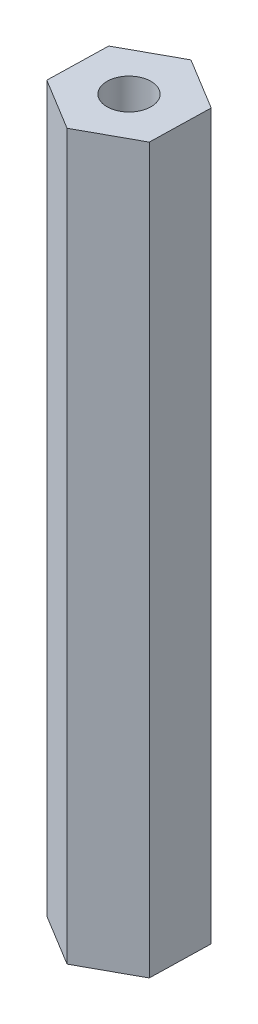
ISO-10303-21;
HEADER;
FILE_DESCRIPTION(('STEP AP214'),'2;1');
FILE_NAME('part.step','',(''),(''),'','','');
FILE_SCHEMA(('AUTOMOTIVE_DESIGN { 1 0 10303 214 1 1 1 1 }'));
ENDSEC;
DATA;
#1=APPLICATION_CONTEXT('core data for automotive mechanical design processes');
#2=APPLICATION_PROTOCOL_DEFINITION('international standard','automotive_design',2000,#1);
#3=PRODUCT_CONTEXT('',#1,'mechanical');
#4=PRODUCT('Part','Part','',(#3));
#5=PRODUCT_RELATED_PRODUCT_CATEGORY('part','',(#4));
#6=PRODUCT_DEFINITION_FORMATION('','',#4);
#7=PRODUCT_DEFINITION_CONTEXT('part definition',#1,'design');
#8=PRODUCT_DEFINITION('design','',#6,#7);
#9=PRODUCT_DEFINITION_SHAPE('','',#8);
#10=(LENGTH_UNIT() NAMED_UNIT(*) SI_UNIT(.MILLI.,.METRE.));
#11=(NAMED_UNIT(*) PLANE_ANGLE_UNIT() SI_UNIT($,.RADIAN.));
#12=(NAMED_UNIT(*) SI_UNIT($,.STERADIAN.) SOLID_ANGLE_UNIT());
#13=UNCERTAINTY_MEASURE_WITH_UNIT(LENGTH_MEASURE(1.E-05),#10,'distance_accuracy_value','');
#14=(GEOMETRIC_REPRESENTATION_CONTEXT(3) GLOBAL_UNCERTAINTY_ASSIGNED_CONTEXT((#13)) GLOBAL_UNIT_ASSIGNED_CONTEXT((#10,
#11,#12)) REPRESENTATION_CONTEXT('',''));
#15=CARTESIAN_POINT('',(0.,0.,0.));
#16=DIRECTION('',(0.,0.,1.));
#17=DIRECTION('',(1.,0.,0.));
#18=AXIS2_PLACEMENT_3D('',#15,#16,#17);
#19=CARTESIAN_POINT('',(4.93223870515652,34.5,3.0010589278935));
#20=DIRECTION('',(-0.999735132754464,0.,-0.0230144375645836));
#21=DIRECTION('',(-0.0230144375645836,0.,0.999735132754464));
#22=AXIS2_PLACEMENT_3D('',#19,#20,#21);
#23=PLANE('',#22);
#24=DIRECTION('',(0.0230144375645836,0.,-0.999735132754464));
#25=VECTOR('',#24,1.);
#26=CARTESIAN_POINT('',(4.93223870515652,-34.5,3.0010589278935));
#27=LINE('',#26,#25);
#28=CARTESIAN_POINT('',(4.93223870515652,-34.5,3.0010589278935));
#29=VERTEX_POINT('',#28);
#30=CARTESIAN_POINT('',(5.06511262238812,-34.5,-2.77091455224766));
#31=VERTEX_POINT('',#30);
#32=EDGE_CURVE('E125',#29,#31,#27,.T.);
#33=ORIENTED_EDGE('',*,*,#32,.T.);
#34=DIRECTION('',(0.,-1.,0.));
#35=VECTOR('',#34,1.);
#36=CARTESIAN_POINT('',(5.06511262238812,34.5,-2.77091455224766));
#37=LINE('',#36,#35);
#38=CARTESIAN_POINT('',(5.06511262238812,34.5,-2.77091455224766));
#39=VERTEX_POINT('',#38);
#40=EDGE_CURVE('E11',#39,#31,#37,.T.);
#41=ORIENTED_EDGE('',*,*,#40,.F.);
#42=DIRECTION('',(0.0230144375645836,0.,-0.999735132754464));
#43=VECTOR('',#42,1.);
#44=CARTESIAN_POINT('',(4.93223870515652,34.5,3.0010589278935));
#45=LINE('',#44,#43);
#46=CARTESIAN_POINT('',(4.93223870515652,34.5,3.0010589278935));
#47=VERTEX_POINT('',#46);
#48=EDGE_CURVE('E136',#47,#39,#45,.T.);
#49=ORIENTED_EDGE('',*,*,#48,.F.);
#50=DIRECTION('',(0.,-1.,0.));
#51=VECTOR('',#50,1.);
#52=CARTESIAN_POINT('',(4.93223870515652,34.5,3.0010589278935));
#53=LINE('',#52,#51);
#54=EDGE_CURVE('E121',#47,#29,#53,.T.);
#55=ORIENTED_EDGE('',*,*,#54,.T.);
#56=EDGE_LOOP('',(#33,#41,#49,#55));
#57=FACE_BOUND('',#56,.T.);
#58=ADVANCED_FACE('F41',(#57),#23,.F.);
#59=CARTESIAN_POINT('',(5.06511262238812,34.5,-2.77091455224766));
#60=DIRECTION('',(-0.519798653961973,0.,0.854288803238882));
#61=DIRECTION('',(0.854288803238882,0.,0.519798653961973));
#62=AXIS2_PLACEMENT_3D('',#59,#60,#61);
#63=PLANE('',#62);
#64=DIRECTION('',(-0.854288803238882,0.,-0.519798653961973));
#65=VECTOR('',#64,1.);
#66=CARTESIAN_POINT('',(5.06511262238812,-34.5,-2.77091455224766));
#67=LINE('',#66,#65);
#68=CARTESIAN_POINT('',(0.132873917231604,-34.5,-5.77197348014116));
#69=VERTEX_POINT('',#68);
#70=EDGE_CURVE('E128',#31,#69,#67,.T.);
#71=ORIENTED_EDGE('',*,*,#70,.T.);
#72=DIRECTION('',(0.,-1.,0.));
#73=VECTOR('',#72,1.);
#74=CARTESIAN_POINT('',(0.132873917231604,34.5,-5.77197348014116));
#75=LINE('',#74,#73);
#76=CARTESIAN_POINT('',(0.132873917231604,34.5,-5.77197348014116));
#77=VERTEX_POINT('',#76);
#78=EDGE_CURVE('E49',#77,#69,#75,.T.);
#79=ORIENTED_EDGE('',*,*,#78,.F.);
#80=DIRECTION('',(-0.854288803238882,0.,-0.519798653961973));
#81=VECTOR('',#80,1.);
#82=CARTESIAN_POINT('',(5.06511262238812,34.5,-2.77091455224766));
#83=LINE('',#82,#81);
#84=EDGE_CURVE('E94',#39,#77,#83,.T.);
#85=ORIENTED_EDGE('',*,*,#84,.F.);
#86=ORIENTED_EDGE('',*,*,#40,.T.);
#87=EDGE_LOOP('',(#71,#79,#85,#86));
#88=FACE_BOUND('',#87,.T.);
#89=ADVANCED_FACE('F161',(#88),#63,.F.);
#90=CARTESIAN_POINT('',(0.132873917231604,34.5,-5.77197348014116));
#91=DIRECTION('',(0.479936478792491,0.,0.877303240803466));
#92=DIRECTION('',(0.877303240803466,0.,-0.479936478792491));
#93=AXIS2_PLACEMENT_3D('',#90,#91,#92);
#94=PLANE('',#93);
#95=DIRECTION('',(-0.877303240803466,0.,0.479936478792492));
#96=VECTOR('',#95,1.);
#97=CARTESIAN_POINT('',(0.132873917231604,-34.5,-5.77197348014116));
#98=LINE('',#97,#96);
#99=CARTESIAN_POINT('',(-4.93223870515652,-34.5,-3.0010589278935));
#100=VERTEX_POINT('',#99);
#101=EDGE_CURVE('E131',#69,#100,#98,.T.);
#102=ORIENTED_EDGE('',*,*,#101,.T.);
#103=DIRECTION('',(0.,-1.,0.));
#104=VECTOR('',#103,1.);
#105=CARTESIAN_POINT('',(-4.93223870515652,34.5,-3.0010589278935));
#106=LINE('',#105,#104);
#107=CARTESIAN_POINT('',(-4.93223870515652,34.5,-3.0010589278935));
#108=VERTEX_POINT('',#107);
#109=EDGE_CURVE('E116',#108,#100,#106,.T.);
#110=ORIENTED_EDGE('',*,*,#109,.F.);
#111=DIRECTION('',(-0.877303240803466,0.,0.479936478792492));
#112=VECTOR('',#111,1.);
#113=CARTESIAN_POINT('',(0.132873917231604,34.5,-5.77197348014116));
#114=LINE('',#113,#112);
#115=EDGE_CURVE('E107',#77,#108,#114,.T.);
#116=ORIENTED_EDGE('',*,*,#115,.F.);
#117=ORIENTED_EDGE('',*,*,#78,.T.);
#118=EDGE_LOOP('',(#102,#110,#116,#117));
#119=FACE_BOUND('',#118,.T.);
#120=ADVANCED_FACE('F142',(#119),#94,.F.);
#121=CARTESIAN_POINT('',(-4.93223870515652,34.5,-3.0010589278935));
#122=DIRECTION('',(0.999735132754464,0.,0.0230144375645838));
#123=DIRECTION('',(0.0230144375645838,0.,-0.999735132754464));
#124=AXIS2_PLACEMENT_3D('',#121,#122,#123);
#125=PLANE('',#124);
#126=DIRECTION('',(-0.0230144375645838,0.,0.999735132754464));
#127=VECTOR('',#126,1.);
#128=CARTESIAN_POINT('',(-4.93223870515652,-34.5,-3.0010589278935));
#129=LINE('',#128,#127);
#130=CARTESIAN_POINT('',(-5.06511262238812,-34.5,2.77091455224766));
#131=VERTEX_POINT('',#130);
#132=EDGE_CURVE('E115',#100,#131,#129,.T.);
#133=ORIENTED_EDGE('',*,*,#132,.T.);
#134=DIRECTION('',(0.,-1.,0.));
#135=VECTOR('',#134,1.);
#136=CARTESIAN_POINT('',(-5.06511262238812,34.5,2.77091455224766));
#137=LINE('',#136,#135);
#138=CARTESIAN_POINT('',(-5.06511262238812,34.5,2.77091455224766));
#139=VERTEX_POINT('',#138);
#140=EDGE_CURVE('E112',#139,#131,#137,.T.);
#141=ORIENTED_EDGE('',*,*,#140,.F.);
#142=DIRECTION('',(-0.0230144375645838,0.,0.999735132754464));
#143=VECTOR('',#142,1.);
#144=CARTESIAN_POINT('',(-4.93223870515652,34.5,-3.0010589278935));
#145=LINE('',#144,#143);
#146=EDGE_CURVE('E101',#108,#139,#145,.T.);
#147=ORIENTED_EDGE('',*,*,#146,.F.);
#148=ORIENTED_EDGE('',*,*,#109,.T.);
#149=EDGE_LOOP('',(#133,#141,#147,#148));
#150=FACE_BOUND('',#149,.T.);
#151=ADVANCED_FACE('F113',(#150),#125,.F.);
#152=CARTESIAN_POINT('',(-5.06511262238812,34.5,2.77091455224766));
#153=DIRECTION('',(0.519798653961973,0.,-0.854288803238882));
#154=DIRECTION('',(-0.854288803238882,0.,-0.519798653961973));
#155=AXIS2_PLACEMENT_3D('',#152,#153,#154);
#156=PLANE('',#155);
#157=DIRECTION('',(0.854288803238882,0.,0.519798653961973));
#158=VECTOR('',#157,1.);
#159=CARTESIAN_POINT('',(-5.06511262238812,-34.5,2.77091455224766));
#160=LINE('',#159,#158);
#161=CARTESIAN_POINT('',(-0.132873917231602,-34.5,5.77197348014116));
#162=VERTEX_POINT('',#161);
#163=EDGE_CURVE('E80',#131,#162,#160,.T.);
#164=ORIENTED_EDGE('',*,*,#163,.T.);
#165=DIRECTION('',(0.,-1.,0.));
#166=VECTOR('',#165,1.);
#167=CARTESIAN_POINT('',(-0.132873917231602,34.5,5.77197348014116));
#168=LINE('',#167,#166);
#169=CARTESIAN_POINT('',(-0.132873917231602,34.5,5.77197348014116));
#170=VERTEX_POINT('',#169);
#171=EDGE_CURVE('E117',#170,#162,#168,.T.);
#172=ORIENTED_EDGE('',*,*,#171,.F.);
#173=DIRECTION('',(0.854288803238882,0.,0.519798653961973));
#174=VECTOR('',#173,1.);
#175=CARTESIAN_POINT('',(-5.06511262238812,34.5,2.77091455224766));
#176=LINE('',#175,#174);
#177=EDGE_CURVE('E105',#139,#170,#176,.T.);
#178=ORIENTED_EDGE('',*,*,#177,.F.);
#179=ORIENTED_EDGE('',*,*,#140,.T.);
#180=EDGE_LOOP('',(#164,#172,#178,#179));
#181=FACE_BOUND('',#180,.T.);
#182=ADVANCED_FACE('F119',(#181),#156,.F.);
#183=CARTESIAN_POINT('',(-0.132873917231602,34.5,5.77197348014116));
#184=DIRECTION('',(-0.479936478792492,0.,-0.877303240803466));
#185=DIRECTION('',(-0.877303240803466,0.,0.479936478792492));
#186=AXIS2_PLACEMENT_3D('',#183,#184,#185);
#187=PLANE('',#186);
#188=DIRECTION('',(0.877303240803466,0.,-0.479936478792492));
#189=VECTOR('',#188,1.);
#190=CARTESIAN_POINT('',(-0.132873917231602,-34.5,5.77197348014116));
#191=LINE('',#190,#189);
#192=EDGE_CURVE('E86',#162,#29,#191,.T.);
#193=ORIENTED_EDGE('',*,*,#192,.T.);
#194=ORIENTED_EDGE('',*,*,#54,.F.);
#195=DIRECTION('',(0.877303240803466,0.,-0.479936478792492));
#196=VECTOR('',#195,1.);
#197=CARTESIAN_POINT('',(-0.132873917231602,34.5,5.77197348014116));
#198=LINE('',#197,#196);
#199=EDGE_CURVE('E57',#170,#47,#198,.T.);
#200=ORIENTED_EDGE('',*,*,#199,.F.);
#201=ORIENTED_EDGE('',*,*,#171,.T.);
#202=EDGE_LOOP('',(#193,#194,#200,#201));
#203=FACE_BOUND('',#202,.T.);
#204=ADVANCED_FACE('F149',(#203),#187,.F.);
#205=CARTESIAN_POINT('',(0.,34.5,0.));
#206=DIRECTION('',(0.,1.,0.));
#207=DIRECTION('',(0.,0.,1.));
#208=AXIS2_PLACEMENT_3D('',#205,#206,#207);
#209=PLANE('',#208);
#210=CARTESIAN_POINT('',(0.,34.5,0.));
#211=DIRECTION('',(0.,1.,0.));
#212=DIRECTION('',(0.,0.,1.));
#213=AXIS2_PLACEMENT_3D('',#210,#211,#212);
#214=CIRCLE('',#213,2.1);
#215=CARTESIAN_POINT('',(0.,34.5,2.1));
#216=VERTEX_POINT('',#215);
#217=EDGE_CURVE('E129',#216,#216,#214,.T.);
#218=ORIENTED_EDGE('',*,*,#217,.F.);
#219=EDGE_LOOP('',(#218));
#220=FACE_BOUND('',#219,.T.);
#221=ORIENTED_EDGE('',*,*,#48,.T.);
#222=ORIENTED_EDGE('',*,*,#84,.T.);
#223=ORIENTED_EDGE('',*,*,#115,.T.);
#224=ORIENTED_EDGE('',*,*,#146,.T.);
#225=ORIENTED_EDGE('',*,*,#177,.T.);
#226=ORIENTED_EDGE('',*,*,#199,.T.);
#227=EDGE_LOOP('',(#221,#222,#223,#224,#225,#226));
#228=FACE_BOUND('',#227,.T.);
#229=ADVANCED_FACE('F103',(#220,#228),#209,.T.);
#230=CARTESIAN_POINT('',(0.,-34.5,0.));
#231=DIRECTION('',(0.,1.,0.));
#232=DIRECTION('',(0.,0.,1.));
#233=AXIS2_PLACEMENT_3D('',#230,#231,#232);
#234=PLANE('',#233);
#235=CARTESIAN_POINT('',(0.,-34.5,0.));
#236=DIRECTION('',(0.,1.,0.));
#237=DIRECTION('',(0.,0.,1.));
#238=AXIS2_PLACEMENT_3D('',#235,#236,#237);
#239=CIRCLE('',#238,2.1);
#240=CARTESIAN_POINT('',(0.,-34.5,2.1));
#241=VERTEX_POINT('',#240);
#242=EDGE_CURVE('E220',#241,#241,#239,.T.);
#243=ORIENTED_EDGE('',*,*,#242,.T.);
#244=EDGE_LOOP('',(#243));
#245=FACE_BOUND('',#244,.T.);
#246=ORIENTED_EDGE('',*,*,#32,.F.);
#247=ORIENTED_EDGE('',*,*,#192,.F.);
#248=ORIENTED_EDGE('',*,*,#163,.F.);
#249=ORIENTED_EDGE('',*,*,#132,.F.);
#250=ORIENTED_EDGE('',*,*,#101,.F.);
#251=ORIENTED_EDGE('',*,*,#70,.F.);
#252=EDGE_LOOP('',(#246,#247,#248,#249,#250,#251));
#253=FACE_BOUND('',#252,.T.);
#254=ADVANCED_FACE('F145',(#245,#253),#234,.F.);
#255=CARTESIAN_POINT('',(0.,-34.5,0.));
#256=DIRECTION('',(0.,1.,0.));
#257=DIRECTION('',(0.,0.,1.));
#258=AXIS2_PLACEMENT_3D('',#255,#256,#257);
#259=CYLINDRICAL_SURFACE('',#258,2.1);
#260=ORIENTED_EDGE('',*,*,#217,.T.);
#261=EDGE_LOOP('',(#260));
#262=FACE_BOUND('',#261,.T.);
#263=ORIENTED_EDGE('',*,*,#242,.F.);
#264=EDGE_LOOP('',(#263));
#265=FACE_BOUND('',#264,.T.);
#266=ADVANCED_FACE('F198',(#262,#265),#259,.F.);
#267=CLOSED_SHELL('',(#58,#89,#120,#151,#182,#204,#229,#254,#266));
#268=MANIFOLD_SOLID_BREP('B2',#267);
#269=ADVANCED_BREP_SHAPE_REPRESENTATION('',(#18,#268),#14);
#270=SHAPE_DEFINITION_REPRESENTATION(#9,#269);
ENDSEC;
END-ISO-10303-21;
